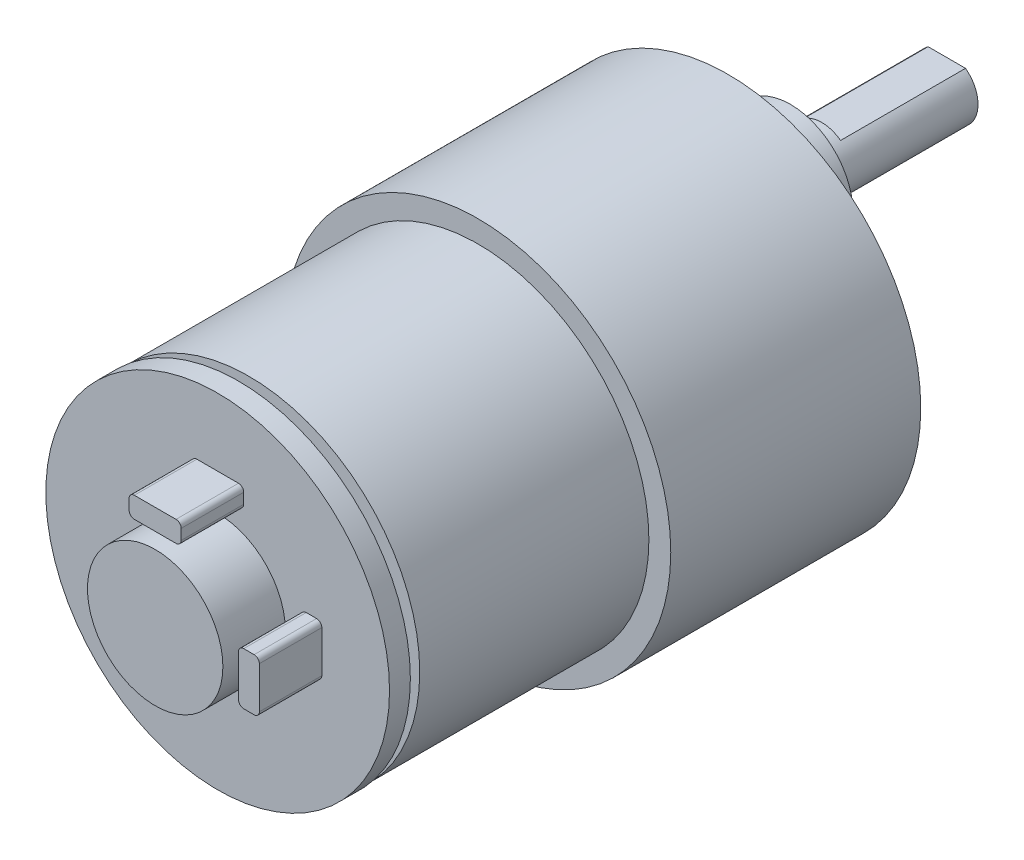
ISO-10303-21;
HEADER;
FILE_DESCRIPTION(('STEP AP214'),'2;1');
FILE_NAME('part.step','',(''),(''),'','','');
FILE_SCHEMA(('AUTOMOTIVE_DESIGN { 1 0 10303 214 1 1 1 1 }'));
ENDSEC;
DATA;
#1=APPLICATION_CONTEXT('core data for automotive mechanical design processes');
#2=APPLICATION_PROTOCOL_DEFINITION('international standard','automotive_design',2000,#1);
#3=PRODUCT_CONTEXT('',#1,'mechanical');
#4=PRODUCT('Part','Part','',(#3));
#5=PRODUCT_RELATED_PRODUCT_CATEGORY('part','',(#4));
#6=PRODUCT_DEFINITION_FORMATION('','',#4);
#7=PRODUCT_DEFINITION_CONTEXT('part definition',#1,'design');
#8=PRODUCT_DEFINITION('design','',#6,#7);
#9=PRODUCT_DEFINITION_SHAPE('','',#8);
#10=(LENGTH_UNIT() NAMED_UNIT(*) SI_UNIT(.MILLI.,.METRE.));
#11=(NAMED_UNIT(*) PLANE_ANGLE_UNIT() SI_UNIT($,.RADIAN.));
#12=(NAMED_UNIT(*) SI_UNIT($,.STERADIAN.) SOLID_ANGLE_UNIT());
#13=UNCERTAINTY_MEASURE_WITH_UNIT(LENGTH_MEASURE(1.E-05),#10,'distance_accuracy_value','');
#14=(GEOMETRIC_REPRESENTATION_CONTEXT(3) GLOBAL_UNCERTAINTY_ASSIGNED_CONTEXT((#13)) GLOBAL_UNIT_ASSIGNED_CONTEXT((#10,
#11,#12)) REPRESENTATION_CONTEXT('',''));
#15=CARTESIAN_POINT('',(0.,0.,0.));
#16=DIRECTION('',(0.,0.,1.));
#17=DIRECTION('',(1.,0.,0.));
#18=AXIS2_PLACEMENT_3D('',#15,#16,#17);
#19=CARTESIAN_POINT('',(0.,0.,49.));
#20=DIRECTION('',(0.,0.,1.));
#21=DIRECTION('',(1.,0.,0.));
#22=AXIS2_PLACEMENT_3D('',#19,#20,#21);
#23=PLANE('',#22);
#24=CARTESIAN_POINT('',(0.,0.,49.));
#25=DIRECTION('',(0.,0.,1.));
#26=DIRECTION('',(1.,0.,0.));
#27=AXIS2_PLACEMENT_3D('',#24,#25,#26);
#28=CIRCLE('',#27,6.5);
#29=CARTESIAN_POINT('',(6.5,0.,49.));
#30=VERTEX_POINT('',#29);
#31=EDGE_CURVE('E12',#30,#30,#28,.T.);
#32=ORIENTED_EDGE('',*,*,#31,.F.);
#33=EDGE_LOOP('',(#32));
#34=FACE_BOUND('',#33,.T.);
#35=CARTESIAN_POINT('',(0.,0.,49.));
#36=DIRECTION('',(0.,0.,1.));
#37=DIRECTION('',(1.,0.,0.));
#38=AXIS2_PLACEMENT_3D('',#35,#36,#37);
#39=CIRCLE('',#38,16.5);
#40=CARTESIAN_POINT('',(16.5,0.,49.));
#41=VERTEX_POINT('',#40);
#42=EDGE_CURVE('E290',#41,#41,#39,.T.);
#43=ORIENTED_EDGE('',*,*,#42,.T.);
#44=EDGE_LOOP('',(#43));
#45=FACE_BOUND('',#44,.T.);
#46=DIRECTION('',(0.,1.,0.));
#47=VECTOR('',#46,1.);
#48=CARTESIAN_POINT('',(10.,2.,49.));
#49=LINE('',#48,#47);
#50=CARTESIAN_POINT('',(10.,-2.,49.));
#51=VERTEX_POINT('',#50);
#52=CARTESIAN_POINT('',(10.,2.,49.));
#53=VERTEX_POINT('',#52);
#54=EDGE_CURVE('E205',#51,#53,#49,.T.);
#55=ORIENTED_EDGE('',*,*,#54,.F.);
#56=CARTESIAN_POINT('',(9.5,-2.,49.));
#57=DIRECTION('',(0.,0.,1.));
#58=DIRECTION('',(1.,0.,0.));
#59=AXIS2_PLACEMENT_3D('',#56,#57,#58);
#60=CIRCLE('',#59,0.5);
#61=CARTESIAN_POINT('',(9.5,-2.5,49.));
#62=VERTEX_POINT('',#61);
#63=EDGE_CURVE('E200',#62,#51,#60,.T.);
#64=ORIENTED_EDGE('',*,*,#63,.F.);
#65=DIRECTION('',(1.,0.,0.));
#66=VECTOR('',#65,1.);
#67=CARTESIAN_POINT('',(8.5,-2.5,49.));
#68=LINE('',#67,#66);
#69=CARTESIAN_POINT('',(8.5,-2.5,49.));
#70=VERTEX_POINT('',#69);
#71=EDGE_CURVE('E216',#70,#62,#68,.T.);
#72=ORIENTED_EDGE('',*,*,#71,.F.);
#73=CARTESIAN_POINT('',(8.5,-2.,49.));
#74=DIRECTION('',(0.,0.,1.));
#75=DIRECTION('',(1.,0.,0.));
#76=AXIS2_PLACEMENT_3D('',#73,#74,#75);
#77=CIRCLE('',#76,0.5);
#78=CARTESIAN_POINT('',(8.,-2.,49.));
#79=VERTEX_POINT('',#78);
#80=EDGE_CURVE('E252',#79,#70,#77,.T.);
#81=ORIENTED_EDGE('',*,*,#80,.F.);
#82=DIRECTION('',(0.,-1.,0.));
#83=VECTOR('',#82,1.);
#84=CARTESIAN_POINT('',(8.,2.,49.));
#85=LINE('',#84,#83);
#86=CARTESIAN_POINT('',(8.,2.,49.));
#87=VERTEX_POINT('',#86);
#88=EDGE_CURVE('E249',#87,#79,#85,.T.);
#89=ORIENTED_EDGE('',*,*,#88,.F.);
#90=CARTESIAN_POINT('',(8.5,2.,49.));
#91=DIRECTION('',(0.,0.,1.));
#92=DIRECTION('',(1.,0.,0.));
#93=AXIS2_PLACEMENT_3D('',#90,#91,#92);
#94=CIRCLE('',#93,0.5);
#95=CARTESIAN_POINT('',(8.5,2.5,49.));
#96=VERTEX_POINT('',#95);
#97=EDGE_CURVE('E246',#96,#87,#94,.T.);
#98=ORIENTED_EDGE('',*,*,#97,.F.);
#99=DIRECTION('',(-1.,0.,0.));
#100=VECTOR('',#99,1.);
#101=CARTESIAN_POINT('',(8.5,2.5,49.));
#102=LINE('',#101,#100);
#103=CARTESIAN_POINT('',(9.5,2.5,49.));
#104=VERTEX_POINT('',#103);
#105=EDGE_CURVE('E243',#104,#96,#102,.T.);
#106=ORIENTED_EDGE('',*,*,#105,.F.);
#107=CARTESIAN_POINT('',(9.5,2.,49.));
#108=DIRECTION('',(0.,0.,1.));
#109=DIRECTION('',(-1.,0.,0.));
#110=AXIS2_PLACEMENT_3D('',#107,#108,#109);
#111=CIRCLE('',#110,0.5);
#112=EDGE_CURVE('E240',#53,#104,#111,.T.);
#113=ORIENTED_EDGE('',*,*,#112,.F.);
#114=EDGE_LOOP('',(#55,#64,#72,#81,#89,#98,#106,#113));
#115=FACE_BOUND('',#114,.T.);
#116=DIRECTION('',(0.,1.,0.));
#117=VECTOR('',#116,1.);
#118=CARTESIAN_POINT('',(2.5,9.5,49.));
#119=LINE('',#118,#117);
#120=CARTESIAN_POINT('',(2.5,8.5,49.));
#121=VERTEX_POINT('',#120);
#122=CARTESIAN_POINT('',(2.5,9.5,49.));
#123=VERTEX_POINT('',#122);
#124=EDGE_CURVE('E892',#121,#123,#119,.T.);
#125=ORIENTED_EDGE('',*,*,#124,.F.);
#126=CARTESIAN_POINT('',(2.,8.5,49.));
#127=DIRECTION('',(0.,0.,1.));
#128=DIRECTION('',(1.,0.,0.));
#129=AXIS2_PLACEMENT_3D('',#126,#127,#128);
#130=CIRCLE('',#129,0.5);
#131=CARTESIAN_POINT('',(2.,8.,49.));
#132=VERTEX_POINT('',#131);
#133=EDGE_CURVE('E197',#132,#121,#130,.T.);
#134=ORIENTED_EDGE('',*,*,#133,.F.);
#135=DIRECTION('',(1.,0.,0.));
#136=VECTOR('',#135,1.);
#137=CARTESIAN_POINT('',(-2.,8.,49.));
#138=LINE('',#137,#136);
#139=CARTESIAN_POINT('',(-2.,8.,49.));
#140=VERTEX_POINT('',#139);
#141=EDGE_CURVE('E193',#140,#132,#138,.T.);
#142=ORIENTED_EDGE('',*,*,#141,.F.);
#143=CARTESIAN_POINT('',(-2.,8.5,49.));
#144=DIRECTION('',(0.,0.,1.));
#145=DIRECTION('',(1.,0.,0.));
#146=AXIS2_PLACEMENT_3D('',#143,#144,#145);
#147=CIRCLE('',#146,0.5);
#148=CARTESIAN_POINT('',(-2.5,8.5,49.));
#149=VERTEX_POINT('',#148);
#150=EDGE_CURVE('E887',#149,#140,#147,.T.);
#151=ORIENTED_EDGE('',*,*,#150,.F.);
#152=DIRECTION('',(0.,-1.,0.));
#153=VECTOR('',#152,1.);
#154=CARTESIAN_POINT('',(-2.5,9.5,49.));
#155=LINE('',#154,#153);
#156=CARTESIAN_POINT('',(-2.5,9.5,49.));
#157=VERTEX_POINT('',#156);
#158=EDGE_CURVE('E909',#157,#149,#155,.T.);
#159=ORIENTED_EDGE('',*,*,#158,.F.);
#160=CARTESIAN_POINT('',(-2.,9.5,49.));
#161=DIRECTION('',(0.,0.,1.));
#162=DIRECTION('',(1.,0.,0.));
#163=AXIS2_PLACEMENT_3D('',#160,#161,#162);
#164=CIRCLE('',#163,0.5);
#165=CARTESIAN_POINT('',(-2.,10.,49.));
#166=VERTEX_POINT('',#165);
#167=EDGE_CURVE('E906',#166,#157,#164,.T.);
#168=ORIENTED_EDGE('',*,*,#167,.F.);
#169=DIRECTION('',(-1.,0.,0.));
#170=VECTOR('',#169,1.);
#171=CARTESIAN_POINT('',(-2.,10.,49.));
#172=LINE('',#171,#170);
#173=CARTESIAN_POINT('',(2.,10.,49.));
#174=VERTEX_POINT('',#173);
#175=EDGE_CURVE('E903',#174,#166,#172,.T.);
#176=ORIENTED_EDGE('',*,*,#175,.F.);
#177=CARTESIAN_POINT('',(2.,9.5,49.));
#178=DIRECTION('',(0.,0.,1.));
#179=DIRECTION('',(-1.,0.,0.));
#180=AXIS2_PLACEMENT_3D('',#177,#178,#179);
#181=CIRCLE('',#180,0.5);
#182=EDGE_CURVE('E896',#123,#174,#181,.T.);
#183=ORIENTED_EDGE('',*,*,#182,.F.);
#184=EDGE_LOOP('',(#125,#134,#142,#151,#159,#168,#176,#183));
#185=FACE_BOUND('',#184,.T.);
#186=ADVANCED_FACE('F43',(#34,#45,#115,#185),#23,.T.);
#187=CARTESIAN_POINT('',(0.,0.,24.));
#188=DIRECTION('',(0.,0.,-1.));
#189=DIRECTION('',(-1.,0.,0.));
#190=AXIS2_PLACEMENT_3D('',#187,#188,#189);
#191=CYLINDRICAL_SURFACE('',#190,18.5);
#192=CARTESIAN_POINT('',(0.,0.,24.));
#193=DIRECTION('',(0.,0.,1.));
#194=DIRECTION('',(1.,0.,0.));
#195=AXIS2_PLACEMENT_3D('',#192,#193,#194);
#196=CIRCLE('',#195,18.5);
#197=CARTESIAN_POINT('',(18.5,0.,24.));
#198=VERTEX_POINT('',#197);
#199=EDGE_CURVE('E343',#198,#198,#196,.T.);
#200=ORIENTED_EDGE('',*,*,#199,.F.);
#201=EDGE_LOOP('',(#200));
#202=FACE_BOUND('',#201,.T.);
#203=CARTESIAN_POINT('',(0.,0.,0.));
#204=DIRECTION('',(0.,0.,1.));
#205=DIRECTION('',(1.,0.,0.));
#206=AXIS2_PLACEMENT_3D('',#203,#204,#205);
#207=CIRCLE('',#206,18.5);
#208=CARTESIAN_POINT('',(18.5,0.,0.));
#209=VERTEX_POINT('',#208);
#210=EDGE_CURVE('E353',#209,#209,#207,.T.);
#211=ORIENTED_EDGE('',*,*,#210,.T.);
#212=EDGE_LOOP('',(#211));
#213=FACE_BOUND('',#212,.T.);
#214=ADVANCED_FACE('F45',(#202,#213),#191,.T.);
#215=CARTESIAN_POINT('',(0.,0.,24.));
#216=DIRECTION('',(0.,0.,1.));
#217=DIRECTION('',(1.,0.,0.));
#218=AXIS2_PLACEMENT_3D('',#215,#216,#217);
#219=PLANE('',#218);
#220=CARTESIAN_POINT('',(0.,0.,24.));
#221=DIRECTION('',(0.,0.,1.));
#222=DIRECTION('',(1.,0.,0.));
#223=AXIS2_PLACEMENT_3D('',#220,#221,#222);
#224=CIRCLE('',#223,16.4);
#225=CARTESIAN_POINT('',(16.4,0.,24.));
#226=VERTEX_POINT('',#225);
#227=EDGE_CURVE('E339',#226,#226,#224,.T.);
#228=ORIENTED_EDGE('',*,*,#227,.F.);
#229=EDGE_LOOP('',(#228));
#230=FACE_BOUND('',#229,.T.);
#231=ORIENTED_EDGE('',*,*,#199,.T.);
#232=EDGE_LOOP('',(#231));
#233=FACE_BOUND('',#232,.T.);
#234=ADVANCED_FACE('F402',(#230,#233),#219,.T.);
#235=CARTESIAN_POINT('',(0.,0.,0.));
#236=DIRECTION('',(0.,0.,1.));
#237=DIRECTION('',(1.,0.,0.));
#238=AXIS2_PLACEMENT_3D('',#235,#236,#237);
#239=PLANE('',#238);
#240=CARTESIAN_POINT('',(0.,7.,0.));
#241=DIRECTION('',(0.,0.,1.));
#242=DIRECTION('',(1.,0.,0.));
#243=AXIS2_PLACEMENT_3D('',#240,#241,#242);
#244=CIRCLE('',#243,6.);
#245=CARTESIAN_POINT('',(6.,7.,0.));
#246=VERTEX_POINT('',#245);
#247=EDGE_CURVE('E47',#246,#246,#244,.F.);
#248=ORIENTED_EDGE('',*,*,#247,.F.);
#249=EDGE_LOOP('',(#248));
#250=FACE_BOUND('',#249,.T.);
#251=CARTESIAN_POINT('',(-15.5,0.,0.));
#252=DIRECTION('',(0.,0.,1.));
#253=DIRECTION('',(1.,0.,0.));
#254=AXIS2_PLACEMENT_3D('',#251,#252,#253);
#255=CIRCLE('',#254,1.5);
#256=CARTESIAN_POINT('',(-14.,0.,0.));
#257=VERTEX_POINT('',#256);
#258=EDGE_CURVE('E344',#257,#257,#255,.T.);
#259=ORIENTED_EDGE('',*,*,#258,.T.);
#260=EDGE_LOOP('',(#259));
#261=FACE_BOUND('',#260,.T.);
#262=CARTESIAN_POINT('',(7.74999999999987,-13.4233937586589,0.));
#263=DIRECTION('',(0.,0.,1.));
#264=DIRECTION('',(1.,0.,0.));
#265=AXIS2_PLACEMENT_3D('',#262,#263,#264);
#266=CIRCLE('',#265,1.5);
#267=CARTESIAN_POINT('',(9.24999999999988,-13.4233937586589,0.));
#268=VERTEX_POINT('',#267);
#269=EDGE_CURVE('E357',#268,#268,#266,.T.);
#270=ORIENTED_EDGE('',*,*,#269,.T.);
#271=EDGE_LOOP('',(#270));
#272=FACE_BOUND('',#271,.T.);
#273=CARTESIAN_POINT('',(15.5,-1.08235921504137E-13,0.));
#274=DIRECTION('',(0.,0.,1.));
#275=DIRECTION('',(1.,0.,0.));
#276=AXIS2_PLACEMENT_3D('',#273,#274,#275);
#277=CIRCLE('',#276,1.5);
#278=CARTESIAN_POINT('',(17.,-1.08235921504137E-13,0.));
#279=VERTEX_POINT('',#278);
#280=EDGE_CURVE('E382',#279,#279,#277,.T.);
#281=ORIENTED_EDGE('',*,*,#280,.T.);
#282=EDGE_LOOP('',(#281));
#283=FACE_BOUND('',#282,.T.);
#284=CARTESIAN_POINT('',(7.75000000000006,13.4233937586588,0.));
#285=DIRECTION('',(0.,0.,1.));
#286=DIRECTION('',(1.,0.,0.));
#287=AXIS2_PLACEMENT_3D('',#284,#285,#286);
#288=CIRCLE('',#287,1.5);
#289=CARTESIAN_POINT('',(9.25000000000006,13.4233937586588,0.));
#290=VERTEX_POINT('',#289);
#291=EDGE_CURVE('E374',#290,#290,#288,.T.);
#292=ORIENTED_EDGE('',*,*,#291,.T.);
#293=EDGE_LOOP('',(#292));
#294=FACE_BOUND('',#293,.T.);
#295=CARTESIAN_POINT('',(-7.75000000000016,-13.4233937586587,0.));
#296=DIRECTION('',(0.,0.,1.));
#297=DIRECTION('',(1.,0.,0.));
#298=AXIS2_PLACEMENT_3D('',#295,#296,#297);
#299=CIRCLE('',#298,1.5);
#300=CARTESIAN_POINT('',(-6.25000000000015,-13.4233937586587,0.));
#301=VERTEX_POINT('',#300);
#302=EDGE_CURVE('E366',#301,#301,#299,.T.);
#303=ORIENTED_EDGE('',*,*,#302,.T.);
#304=EDGE_LOOP('',(#303));
#305=FACE_BOUND('',#304,.T.);
#306=CARTESIAN_POINT('',(-7.74999999999997,13.4233937586588,0.));
#307=DIRECTION('',(0.,0.,1.));
#308=DIRECTION('',(1.,0.,0.));
#309=AXIS2_PLACEMENT_3D('',#306,#307,#308);
#310=CIRCLE('',#309,1.5);
#311=CARTESIAN_POINT('',(-6.24999999999997,13.4233937586588,0.));
#312=VERTEX_POINT('',#311);
#313=EDGE_CURVE('E349',#312,#312,#310,.T.);
#314=ORIENTED_EDGE('',*,*,#313,.T.);
#315=EDGE_LOOP('',(#314));
#316=FACE_BOUND('',#315,.T.);
#317=ORIENTED_EDGE('',*,*,#210,.F.);
#318=EDGE_LOOP('',(#317));
#319=FACE_BOUND('',#318,.T.);
#320=ADVANCED_FACE('F399',(#250,#261,#272,#283,#294,#305,#316,#319),#239,.F.);
#321=CARTESIAN_POINT('',(-7.74999999999997,13.4233937586588,28.2426406871193));
#322=DIRECTION('',(0.,0.,-1.));
#323=DIRECTION('',(-1.,0.,0.));
#324=AXIS2_PLACEMENT_3D('',#321,#322,#323);
#325=CYLINDRICAL_SURFACE('',#324,1.5);
#326=ORIENTED_EDGE('',*,*,#313,.F.);
#327=EDGE_LOOP('',(#326));
#328=FACE_BOUND('',#327,.T.);
#329=CARTESIAN_POINT('',(-7.74999999999997,13.4233937586588,20.));
#330=DIRECTION('',(0.,0.,1.));
#331=DIRECTION('',(1.,0.,0.));
#332=AXIS2_PLACEMENT_3D('',#329,#330,#331);
#333=CIRCLE('',#332,1.5);
#334=CARTESIAN_POINT('',(-6.24999999999997,13.4233937586588,20.));
#335=VERTEX_POINT('',#334);
#336=EDGE_CURVE('E362',#335,#335,#333,.T.);
#337=ORIENTED_EDGE('',*,*,#336,.T.);
#338=EDGE_LOOP('',(#337));
#339=FACE_BOUND('',#338,.T.);
#340=ADVANCED_FACE('F401',(#328,#339),#325,.F.);
#341=CARTESIAN_POINT('',(0.,0.,20.));
#342=DIRECTION('',(0.,0.,1.));
#343=DIRECTION('',(1.,0.,0.));
#344=AXIS2_PLACEMENT_3D('',#341,#342,#343);
#345=PLANE('',#344);
#346=ORIENTED_EDGE('',*,*,#336,.F.);
#347=EDGE_LOOP('',(#346));
#348=FACE_BOUND('',#347,.T.);
#349=ADVANCED_FACE('F408',(#348),#345,.F.);
#350=CARTESIAN_POINT('',(-7.75000000000016,-13.4233937586587,28.2426406871193));
#351=DIRECTION('',(0.,0.,-1.));
#352=DIRECTION('',(-1.,0.,0.));
#353=AXIS2_PLACEMENT_3D('',#350,#351,#352);
#354=CYLINDRICAL_SURFACE('',#353,1.5);
#355=ORIENTED_EDGE('',*,*,#302,.F.);
#356=EDGE_LOOP('',(#355));
#357=FACE_BOUND('',#356,.T.);
#358=CARTESIAN_POINT('',(-7.75000000000016,-13.4233937586587,20.));
#359=DIRECTION('',(0.,0.,1.));
#360=DIRECTION('',(1.,0.,0.));
#361=AXIS2_PLACEMENT_3D('',#358,#359,#360);
#362=CIRCLE('',#361,1.5);
#363=CARTESIAN_POINT('',(-6.25000000000015,-13.4233937586587,20.));
#364=VERTEX_POINT('',#363);
#365=EDGE_CURVE('E370',#364,#364,#362,.T.);
#366=ORIENTED_EDGE('',*,*,#365,.T.);
#367=EDGE_LOOP('',(#366));
#368=FACE_BOUND('',#367,.T.);
#369=ADVANCED_FACE('F490',(#357,#368),#354,.F.);
#370=CARTESIAN_POINT('',(0.,0.,20.));
#371=DIRECTION('',(0.,0.,1.));
#372=DIRECTION('',(1.,0.,0.));
#373=AXIS2_PLACEMENT_3D('',#370,#371,#372);
#374=PLANE('',#373);
#375=ORIENTED_EDGE('',*,*,#365,.F.);
#376=EDGE_LOOP('',(#375));
#377=FACE_BOUND('',#376,.T.);
#378=ADVANCED_FACE('F493',(#377),#374,.F.);
#379=CARTESIAN_POINT('',(7.75000000000006,13.4233937586588,28.2426406871193));
#380=DIRECTION('',(0.,0.,-1.));
#381=DIRECTION('',(-1.,0.,0.));
#382=AXIS2_PLACEMENT_3D('',#379,#380,#381);
#383=CYLINDRICAL_SURFACE('',#382,1.5);
#384=ORIENTED_EDGE('',*,*,#291,.F.);
#385=EDGE_LOOP('',(#384));
#386=FACE_BOUND('',#385,.T.);
#387=CARTESIAN_POINT('',(7.75000000000006,13.4233937586588,20.));
#388=DIRECTION('',(0.,0.,1.));
#389=DIRECTION('',(1.,0.,0.));
#390=AXIS2_PLACEMENT_3D('',#387,#388,#389);
#391=CIRCLE('',#390,1.5);
#392=CARTESIAN_POINT('',(9.25000000000006,13.4233937586588,20.));
#393=VERTEX_POINT('',#392);
#394=EDGE_CURVE('E378',#393,#393,#391,.T.);
#395=ORIENTED_EDGE('',*,*,#394,.T.);
#396=EDGE_LOOP('',(#395));
#397=FACE_BOUND('',#396,.T.);
#398=ADVANCED_FACE('F496',(#386,#397),#383,.F.);
#399=CARTESIAN_POINT('',(0.,0.,20.));
#400=DIRECTION('',(0.,0.,1.));
#401=DIRECTION('',(1.,0.,0.));
#402=AXIS2_PLACEMENT_3D('',#399,#400,#401);
#403=PLANE('',#402);
#404=ORIENTED_EDGE('',*,*,#394,.F.);
#405=EDGE_LOOP('',(#404));
#406=FACE_BOUND('',#405,.T.);
#407=ADVANCED_FACE('F501',(#406),#403,.F.);
#408=CARTESIAN_POINT('',(15.5,-1.08235921504137E-13,28.2426406871193));
#409=DIRECTION('',(0.,0.,-1.));
#410=DIRECTION('',(-1.,0.,0.));
#411=AXIS2_PLACEMENT_3D('',#408,#409,#410);
#412=CYLINDRICAL_SURFACE('',#411,1.5);
#413=ORIENTED_EDGE('',*,*,#280,.F.);
#414=EDGE_LOOP('',(#413));
#415=FACE_BOUND('',#414,.T.);
#416=CARTESIAN_POINT('',(15.5,-1.08235921504137E-13,20.));
#417=DIRECTION('',(0.,0.,1.));
#418=DIRECTION('',(1.,0.,0.));
#419=AXIS2_PLACEMENT_3D('',#416,#417,#418);
#420=CIRCLE('',#419,1.5);
#421=CARTESIAN_POINT('',(17.,-1.08235921504137E-13,20.));
#422=VERTEX_POINT('',#421);
#423=EDGE_CURVE('E361',#422,#422,#420,.T.);
#424=ORIENTED_EDGE('',*,*,#423,.T.);
#425=EDGE_LOOP('',(#424));
#426=FACE_BOUND('',#425,.T.);
#427=ADVANCED_FACE('F504',(#415,#426),#412,.F.);
#428=CARTESIAN_POINT('',(0.,0.,20.));
#429=DIRECTION('',(0.,0.,1.));
#430=DIRECTION('',(1.,0.,0.));
#431=AXIS2_PLACEMENT_3D('',#428,#429,#430);
#432=PLANE('',#431);
#433=ORIENTED_EDGE('',*,*,#423,.F.);
#434=EDGE_LOOP('',(#433));
#435=FACE_BOUND('',#434,.T.);
#436=ADVANCED_FACE('F487',(#435),#432,.F.);
#437=CARTESIAN_POINT('',(7.74999999999987,-13.4233937586589,28.2426406871193));
#438=DIRECTION('',(0.,0.,-1.));
#439=DIRECTION('',(-1.,0.,0.));
#440=AXIS2_PLACEMENT_3D('',#437,#438,#439);
#441=CYLINDRICAL_SURFACE('',#440,1.5);
#442=ORIENTED_EDGE('',*,*,#269,.F.);
#443=EDGE_LOOP('',(#442));
#444=FACE_BOUND('',#443,.T.);
#445=CARTESIAN_POINT('',(7.74999999999987,-13.4233937586589,20.));
#446=DIRECTION('',(0.,0.,1.));
#447=DIRECTION('',(1.,0.,0.));
#448=AXIS2_PLACEMENT_3D('',#445,#446,#447);
#449=CIRCLE('',#448,1.5);
#450=CARTESIAN_POINT('',(9.24999999999988,-13.4233937586589,20.));
#451=VERTEX_POINT('',#450);
#452=EDGE_CURVE('E338',#451,#451,#449,.T.);
#453=ORIENTED_EDGE('',*,*,#452,.T.);
#454=EDGE_LOOP('',(#453));
#455=FACE_BOUND('',#454,.T.);
#456=ADVANCED_FACE('F483',(#444,#455),#441,.F.);
#457=CARTESIAN_POINT('',(0.,0.,20.));
#458=DIRECTION('',(0.,0.,1.));
#459=DIRECTION('',(1.,0.,0.));
#460=AXIS2_PLACEMENT_3D('',#457,#458,#459);
#461=PLANE('',#460);
#462=ORIENTED_EDGE('',*,*,#452,.F.);
#463=EDGE_LOOP('',(#462));
#464=FACE_BOUND('',#463,.T.);
#465=ADVANCED_FACE('F476',(#464),#461,.F.);
#466=CARTESIAN_POINT('',(-15.5,0.,28.2426406871193));
#467=DIRECTION('',(0.,0.,-1.));
#468=DIRECTION('',(-1.,0.,0.));
#469=AXIS2_PLACEMENT_3D('',#466,#467,#468);
#470=CYLINDRICAL_SURFACE('',#469,1.5);
#471=ORIENTED_EDGE('',*,*,#258,.F.);
#472=EDGE_LOOP('',(#471));
#473=FACE_BOUND('',#472,.T.);
#474=CARTESIAN_POINT('',(-15.5,0.,20.));
#475=DIRECTION('',(0.,0.,1.));
#476=DIRECTION('',(1.,0.,0.));
#477=AXIS2_PLACEMENT_3D('',#474,#475,#476);
#478=CIRCLE('',#477,1.5);
#479=CARTESIAN_POINT('',(-14.,0.,20.));
#480=VERTEX_POINT('',#479);
#481=EDGE_CURVE('E348',#480,#480,#478,.T.);
#482=ORIENTED_EDGE('',*,*,#481,.T.);
#483=EDGE_LOOP('',(#482));
#484=FACE_BOUND('',#483,.T.);
#485=ADVANCED_FACE('F473',(#473,#484),#470,.F.);
#486=CARTESIAN_POINT('',(0.,0.,20.));
#487=DIRECTION('',(0.,0.,1.));
#488=DIRECTION('',(1.,0.,0.));
#489=AXIS2_PLACEMENT_3D('',#486,#487,#488);
#490=PLANE('',#489);
#491=ORIENTED_EDGE('',*,*,#481,.F.);
#492=EDGE_LOOP('',(#491));
#493=FACE_BOUND('',#492,.T.);
#494=ADVANCED_FACE('F471',(#493),#490,.F.);
#495=CARTESIAN_POINT('',(0.,0.,46.));
#496=DIRECTION('',(0.,0.,-1.));
#497=DIRECTION('',(-1.,0.,0.));
#498=AXIS2_PLACEMENT_3D('',#495,#496,#497);
#499=CYLINDRICAL_SURFACE('',#498,16.4);
#500=CARTESIAN_POINT('',(0.,0.,46.));
#501=DIRECTION('',(0.,0.,1.));
#502=DIRECTION('',(1.,0.,0.));
#503=AXIS2_PLACEMENT_3D('',#500,#501,#502);
#504=CIRCLE('',#503,16.4);
#505=CARTESIAN_POINT('',(16.4,0.,46.));
#506=VERTEX_POINT('',#505);
#507=EDGE_CURVE('E334',#506,#506,#504,.T.);
#508=ORIENTED_EDGE('',*,*,#507,.F.);
#509=EDGE_LOOP('',(#508));
#510=FACE_BOUND('',#509,.T.);
#511=ORIENTED_EDGE('',*,*,#227,.T.);
#512=EDGE_LOOP('',(#511));
#513=FACE_BOUND('',#512,.T.);
#514=ADVANCED_FACE('F467',(#510,#513),#499,.T.);
#515=CARTESIAN_POINT('',(0.,0.,46.));
#516=DIRECTION('',(0.,0.,1.));
#517=DIRECTION('',(1.,0.,0.));
#518=AXIS2_PLACEMENT_3D('',#515,#516,#517);
#519=PLANE('',#518);
#520=CARTESIAN_POINT('',(0.,0.,46.));
#521=DIRECTION('',(0.,0.,1.));
#522=DIRECTION('',(1.,0.,0.));
#523=AXIS2_PLACEMENT_3D('',#520,#521,#522);
#524=CIRCLE('',#523,15.);
#525=CARTESIAN_POINT('',(15.,0.,46.));
#526=VERTEX_POINT('',#525);
#527=EDGE_CURVE('E53',#526,#526,#524,.T.);
#528=ORIENTED_EDGE('',*,*,#527,.F.);
#529=EDGE_LOOP('',(#528));
#530=FACE_BOUND('',#529,.T.);
#531=ORIENTED_EDGE('',*,*,#507,.T.);
#532=EDGE_LOOP('',(#531));
#533=FACE_BOUND('',#532,.T.);
#534=ADVANCED_FACE('F463',(#530,#533),#519,.T.);
#535=CARTESIAN_POINT('',(0.,7.,-6.));
#536=DIRECTION('',(0.,0.,1.));
#537=DIRECTION('',(1.,0.,0.));
#538=AXIS2_PLACEMENT_3D('',#535,#536,#537);
#539=CYLINDRICAL_SURFACE('',#538,6.);
#540=CARTESIAN_POINT('',(0.,7.,-6.));
#541=DIRECTION('',(0.,0.,-1.));
#542=DIRECTION('',(-1.,0.,0.));
#543=AXIS2_PLACEMENT_3D('',#540,#541,#542);
#544=CIRCLE('',#543,6.);
#545=CARTESIAN_POINT('',(-6.,7.,-6.));
#546=VERTEX_POINT('',#545);
#547=EDGE_CURVE('E327',#546,#546,#544,.T.);
#548=ORIENTED_EDGE('',*,*,#547,.F.);
#549=EDGE_LOOP('',(#548));
#550=FACE_BOUND('',#549,.T.);
#551=ORIENTED_EDGE('',*,*,#247,.T.);
#552=EDGE_LOOP('',(#551));
#553=FACE_BOUND('',#552,.T.);
#554=ADVANCED_FACE('F459',(#550,#553),#539,.T.);
#555=CARTESIAN_POINT('',(0.,7.,-6.));
#556=DIRECTION('',(0.,0.,-1.));
#557=DIRECTION('',(-1.,0.,0.));
#558=AXIS2_PLACEMENT_3D('',#555,#556,#557);
#559=PLANE('',#558);
#560=CARTESIAN_POINT('',(0.,7.,-6.));
#561=DIRECTION('',(0.,0.,-1.));
#562=DIRECTION('',(-1.,0.,0.));
#563=AXIS2_PLACEMENT_3D('',#560,#561,#562);
#564=CIRCLE('',#563,3.);
#565=CARTESIAN_POINT('',(-3.,7.,-6.));
#566=VERTEX_POINT('',#565);
#567=EDGE_CURVE('E305',#566,#566,#564,.T.);
#568=ORIENTED_EDGE('',*,*,#567,.F.);
#569=EDGE_LOOP('',(#568));
#570=FACE_BOUND('',#569,.T.);
#571=ORIENTED_EDGE('',*,*,#547,.T.);
#572=EDGE_LOOP('',(#571));
#573=FACE_BOUND('',#572,.T.);
#574=ADVANCED_FACE('F455',(#570,#573),#559,.T.);
#575=CARTESIAN_POINT('',(0.,7.,-9.));
#576=DIRECTION('',(0.,0.,1.));
#577=DIRECTION('',(1.,0.,0.));
#578=AXIS2_PLACEMENT_3D('',#575,#576,#577);
#579=CYLINDRICAL_SURFACE('',#578,3.);
#580=CARTESIAN_POINT('',(0.,7.,-9.));
#581=DIRECTION('',(0.,0.,-1.));
#582=DIRECTION('',(-1.,0.,0.));
#583=AXIS2_PLACEMENT_3D('',#580,#581,#582);
#584=CIRCLE('',#583,3.);
#585=CARTESIAN_POINT('',(-1.8,9.4,-9.));
#586=VERTEX_POINT('',#585);
#587=CARTESIAN_POINT('',(1.8,9.4,-9.));
#588=VERTEX_POINT('',#587);
#589=EDGE_CURVE('E324',#586,#588,#584,.T.);
#590=ORIENTED_EDGE('',*,*,#589,.F.);
#591=DIRECTION('',(0.,0.,1.));
#592=VECTOR('',#591,1.);
#593=CARTESIAN_POINT('',(-1.8,9.4,-21.));
#594=LINE('',#593,#592);
#595=CARTESIAN_POINT('',(-1.8,9.4,-21.));
#596=VERTEX_POINT('',#595);
#597=EDGE_CURVE('E320',#596,#586,#594,.T.);
#598=ORIENTED_EDGE('',*,*,#597,.F.);
#599=CARTESIAN_POINT('',(0.,7.,-21.));
#600=DIRECTION('',(0.,0.,-1.));
#601=DIRECTION('',(-1.,0.,0.));
#602=AXIS2_PLACEMENT_3D('',#599,#600,#601);
#603=CIRCLE('',#602,3.);
#604=CARTESIAN_POINT('',(1.8,9.4,-21.));
#605=VERTEX_POINT('',#604);
#606=EDGE_CURVE('E306',#605,#596,#603,.T.);
#607=ORIENTED_EDGE('',*,*,#606,.F.);
#608=DIRECTION('',(0.,0.,1.));
#609=VECTOR('',#608,1.);
#610=CARTESIAN_POINT('',(1.8,9.4,-21.));
#611=LINE('',#610,#609);
#612=EDGE_CURVE('E313',#605,#588,#611,.T.);
#613=ORIENTED_EDGE('',*,*,#612,.T.);
#614=EDGE_LOOP('',(#590,#598,#607,#613));
#615=FACE_BOUND('',#614,.T.);
#616=ORIENTED_EDGE('',*,*,#567,.T.);
#617=EDGE_LOOP('',(#616));
#618=FACE_BOUND('',#617,.T.);
#619=ADVANCED_FACE('F451',(#615,#618),#579,.T.);
#620=CARTESIAN_POINT('',(0.,7.,-9.));
#621=DIRECTION('',(0.,0.,-1.));
#622=DIRECTION('',(-1.,0.,0.));
#623=AXIS2_PLACEMENT_3D('',#620,#621,#622);
#624=PLANE('',#623);
#625=DIRECTION('',(1.,0.,0.));
#626=VECTOR('',#625,1.);
#627=CARTESIAN_POINT('',(1.8,9.4,-9.));
#628=LINE('',#627,#626);
#629=EDGE_CURVE('E301',#586,#588,#628,.T.);
#630=ORIENTED_EDGE('',*,*,#629,.F.);
#631=ORIENTED_EDGE('',*,*,#589,.T.);
#632=EDGE_LOOP('',(#630,#631));
#633=FACE_BOUND('',#632,.T.);
#634=ADVANCED_FACE('F447',(#633),#624,.T.);
#635=CARTESIAN_POINT('',(1.8,9.4,-21.));
#636=DIRECTION('',(0.,-1.,0.));
#637=DIRECTION('',(0.,0.,-1.));
#638=AXIS2_PLACEMENT_3D('',#635,#636,#637);
#639=PLANE('',#638);
#640=ORIENTED_EDGE('',*,*,#629,.T.);
#641=ORIENTED_EDGE('',*,*,#612,.F.);
#642=DIRECTION('',(1.,0.,0.));
#643=VECTOR('',#642,1.);
#644=CARTESIAN_POINT('',(1.8,9.4,-21.));
#645=LINE('',#644,#643);
#646=EDGE_CURVE('E310',#596,#605,#645,.T.);
#647=ORIENTED_EDGE('',*,*,#646,.F.);
#648=ORIENTED_EDGE('',*,*,#597,.T.);
#649=EDGE_LOOP('',(#640,#641,#647,#648));
#650=FACE_BOUND('',#649,.T.);
#651=ADVANCED_FACE('F443',(#650),#639,.F.);
#652=CARTESIAN_POINT('',(0.,7.,-21.));
#653=DIRECTION('',(0.,0.,-1.));
#654=DIRECTION('',(-1.,0.,0.));
#655=AXIS2_PLACEMENT_3D('',#652,#653,#654);
#656=PLANE('',#655);
#657=ORIENTED_EDGE('',*,*,#606,.T.);
#658=ORIENTED_EDGE('',*,*,#646,.T.);
#659=EDGE_LOOP('',(#657,#658));
#660=FACE_BOUND('',#659,.T.);
#661=ADVANCED_FACE('F439',(#660),#656,.T.);
#662=CARTESIAN_POINT('',(0.,0.,47.));
#663=DIRECTION('',(0.,0.,-1.));
#664=DIRECTION('',(-1.,0.,0.));
#665=AXIS2_PLACEMENT_3D('',#662,#663,#664);
#666=CYLINDRICAL_SURFACE('',#665,15.);
#667=CARTESIAN_POINT('',(0.,0.,47.));
#668=DIRECTION('',(0.,0.,1.));
#669=DIRECTION('',(1.,0.,0.));
#670=AXIS2_PLACEMENT_3D('',#667,#668,#669);
#671=CIRCLE('',#670,15.);
#672=CARTESIAN_POINT('',(15.,0.,47.));
#673=VERTEX_POINT('',#672);
#674=EDGE_CURVE('E294',#673,#673,#671,.T.);
#675=ORIENTED_EDGE('',*,*,#674,.F.);
#676=EDGE_LOOP('',(#675));
#677=FACE_BOUND('',#676,.T.);
#678=ORIENTED_EDGE('',*,*,#527,.T.);
#679=EDGE_LOOP('',(#678));
#680=FACE_BOUND('',#679,.T.);
#681=ADVANCED_FACE('F435',(#677,#680),#666,.T.);
#682=CARTESIAN_POINT('',(0.,0.,49.));
#683=DIRECTION('',(0.,0.,-1.));
#684=DIRECTION('',(-1.,0.,0.));
#685=AXIS2_PLACEMENT_3D('',#682,#683,#684);
#686=CYLINDRICAL_SURFACE('',#685,16.5);
#687=ORIENTED_EDGE('',*,*,#42,.F.);
#688=EDGE_LOOP('',(#687));
#689=FACE_BOUND('',#688,.T.);
#690=CARTESIAN_POINT('',(0.,0.,47.));
#691=DIRECTION('',(0.,0.,1.));
#692=DIRECTION('',(1.,0.,0.));
#693=AXIS2_PLACEMENT_3D('',#690,#691,#692);
#694=CIRCLE('',#693,16.5);
#695=CARTESIAN_POINT('',(16.5,0.,47.));
#696=VERTEX_POINT('',#695);
#697=EDGE_CURVE('E288',#696,#696,#694,.T.);
#698=ORIENTED_EDGE('',*,*,#697,.T.);
#699=EDGE_LOOP('',(#698));
#700=FACE_BOUND('',#699,.T.);
#701=ADVANCED_FACE('F431',(#689,#700),#686,.T.);
#702=CARTESIAN_POINT('',(0.,0.,47.));
#703=DIRECTION('',(0.,0.,1.));
#704=DIRECTION('',(1.,0.,0.));
#705=AXIS2_PLACEMENT_3D('',#702,#703,#704);
#706=PLANE('',#705);
#707=ORIENTED_EDGE('',*,*,#674,.T.);
#708=EDGE_LOOP('',(#707));
#709=FACE_BOUND('',#708,.T.);
#710=ORIENTED_EDGE('',*,*,#697,.F.);
#711=EDGE_LOOP('',(#710));
#712=FACE_BOUND('',#711,.T.);
#713=ADVANCED_FACE('F428',(#709,#712),#706,.F.);
#714=CARTESIAN_POINT('',(0.,0.,55.));
#715=DIRECTION('',(0.,0.,-1.));
#716=DIRECTION('',(-1.,0.,0.));
#717=AXIS2_PLACEMENT_3D('',#714,#715,#716);
#718=CYLINDRICAL_SURFACE('',#717,6.5);
#719=CARTESIAN_POINT('',(0.,0.,55.));
#720=DIRECTION('',(0.,0.,1.));
#721=DIRECTION('',(1.,0.,0.));
#722=AXIS2_PLACEMENT_3D('',#719,#720,#721);
#723=CIRCLE('',#722,6.5);
#724=CARTESIAN_POINT('',(6.5,0.,55.));
#725=VERTEX_POINT('',#724);
#726=EDGE_CURVE('E285',#725,#725,#723,.T.);
#727=ORIENTED_EDGE('',*,*,#726,.F.);
#728=EDGE_LOOP('',(#727));
#729=FACE_BOUND('',#728,.T.);
#730=ORIENTED_EDGE('',*,*,#31,.T.);
#731=EDGE_LOOP('',(#730));
#732=FACE_BOUND('',#731,.T.);
#733=ADVANCED_FACE('F426',(#729,#732),#718,.T.);
#734=CARTESIAN_POINT('',(0.,0.,55.));
#735=DIRECTION('',(0.,0.,1.));
#736=DIRECTION('',(1.,0.,0.));
#737=AXIS2_PLACEMENT_3D('',#734,#735,#736);
#738=PLANE('',#737);
#739=ORIENTED_EDGE('',*,*,#726,.T.);
#740=EDGE_LOOP('',(#739));
#741=FACE_BOUND('',#740,.T.);
#742=ADVANCED_FACE('F605',(#741),#738,.T.);
#743=CARTESIAN_POINT('',(9.5,-2.,55.));
#744=DIRECTION('',(0.,0.,-1.));
#745=DIRECTION('',(-1.,0.,0.));
#746=AXIS2_PLACEMENT_3D('',#743,#744,#745);
#747=CYLINDRICAL_SURFACE('',#746,0.5);
#748=ORIENTED_EDGE('',*,*,#63,.T.);
#749=DIRECTION('',(0.,0.,-1.));
#750=VECTOR('',#749,1.);
#751=CARTESIAN_POINT('',(10.,-2.,55.));
#752=LINE('',#751,#750);
#753=CARTESIAN_POINT('',(10.,-2.,55.));
#754=VERTEX_POINT('',#753);
#755=EDGE_CURVE('E282',#754,#51,#752,.T.);
#756=ORIENTED_EDGE('',*,*,#755,.F.);
#757=CARTESIAN_POINT('',(9.5,-2.,55.));
#758=DIRECTION('',(0.,0.,1.));
#759=DIRECTION('',(1.,0.,0.));
#760=AXIS2_PLACEMENT_3D('',#757,#758,#759);
#761=CIRCLE('',#760,0.5);
#762=CARTESIAN_POINT('',(9.5,-2.5,55.));
#763=VERTEX_POINT('',#762);
#764=EDGE_CURVE('E211',#763,#754,#761,.T.);
#765=ORIENTED_EDGE('',*,*,#764,.F.);
#766=DIRECTION('',(0.,0.,-1.));
#767=VECTOR('',#766,1.);
#768=CARTESIAN_POINT('',(9.5,-2.5,55.));
#769=LINE('',#768,#767);
#770=EDGE_CURVE('E236',#763,#62,#769,.T.);
#771=ORIENTED_EDGE('',*,*,#770,.T.);
#772=EDGE_LOOP('',(#748,#756,#765,#771));
#773=FACE_BOUND('',#772,.T.);
#774=ADVANCED_FACE('F612',(#773),#747,.T.);
#775=CARTESIAN_POINT('',(10.,2.,55.));
#776=DIRECTION('',(-1.,0.,0.));
#777=DIRECTION('',(0.,0.,1.));
#778=AXIS2_PLACEMENT_3D('',#775,#776,#777);
#779=PLANE('',#778);
#780=ORIENTED_EDGE('',*,*,#54,.T.);
#781=DIRECTION('',(0.,0.,-1.));
#782=VECTOR('',#781,1.);
#783=CARTESIAN_POINT('',(10.,2.,55.));
#784=LINE('',#783,#782);
#785=CARTESIAN_POINT('',(10.,2.,55.));
#786=VERTEX_POINT('',#785);
#787=EDGE_CURVE('E278',#786,#53,#784,.T.);
#788=ORIENTED_EDGE('',*,*,#787,.F.);
#789=DIRECTION('',(0.,1.,0.));
#790=VECTOR('',#789,1.);
#791=CARTESIAN_POINT('',(10.,2.,55.));
#792=LINE('',#791,#790);
#793=EDGE_CURVE('E215',#754,#786,#792,.T.);
#794=ORIENTED_EDGE('',*,*,#793,.F.);
#795=ORIENTED_EDGE('',*,*,#755,.T.);
#796=EDGE_LOOP('',(#780,#788,#794,#795));
#797=FACE_BOUND('',#796,.T.);
#798=ADVANCED_FACE('F619',(#797),#779,.F.);
#799=CARTESIAN_POINT('',(9.5,2.,55.));
#800=DIRECTION('',(0.,0.,-1.));
#801=DIRECTION('',(-1.,0.,0.));
#802=AXIS2_PLACEMENT_3D('',#799,#800,#801);
#803=CYLINDRICAL_SURFACE('',#802,0.5);
#804=ORIENTED_EDGE('',*,*,#112,.T.);
#805=DIRECTION('',(0.,0.,-1.));
#806=VECTOR('',#805,1.);
#807=CARTESIAN_POINT('',(9.5,2.5,55.));
#808=LINE('',#807,#806);
#809=CARTESIAN_POINT('',(9.5,2.5,55.));
#810=VERTEX_POINT('',#809);
#811=EDGE_CURVE('E274',#810,#104,#808,.T.);
#812=ORIENTED_EDGE('',*,*,#811,.F.);
#813=CARTESIAN_POINT('',(9.5,2.,55.));
#814=DIRECTION('',(0.,0.,1.));
#815=DIRECTION('',(-1.,0.,0.));
#816=AXIS2_PLACEMENT_3D('',#813,#814,#815);
#817=CIRCLE('',#816,0.5);
#818=EDGE_CURVE('E219',#786,#810,#817,.T.);
#819=ORIENTED_EDGE('',*,*,#818,.F.);
#820=ORIENTED_EDGE('',*,*,#787,.T.);
#821=EDGE_LOOP('',(#804,#812,#819,#820));
#822=FACE_BOUND('',#821,.T.);
#823=ADVANCED_FACE('F627',(#822),#803,.T.);
#824=CARTESIAN_POINT('',(8.5,2.5,55.));
#825=DIRECTION('',(0.,-1.,0.));
#826=DIRECTION('',(1.,0.,0.));
#827=AXIS2_PLACEMENT_3D('',#824,#825,#826);
#828=PLANE('',#827);
#829=ORIENTED_EDGE('',*,*,#105,.T.);
#830=DIRECTION('',(0.,0.,-1.));
#831=VECTOR('',#830,1.);
#832=CARTESIAN_POINT('',(8.5,2.5,55.));
#833=LINE('',#832,#831);
#834=CARTESIAN_POINT('',(8.5,2.5,55.));
#835=VERTEX_POINT('',#834);
#836=EDGE_CURVE('E270',#835,#96,#833,.T.);
#837=ORIENTED_EDGE('',*,*,#836,.F.);
#838=DIRECTION('',(-1.,0.,0.));
#839=VECTOR('',#838,1.);
#840=CARTESIAN_POINT('',(8.5,2.5,55.));
#841=LINE('',#840,#839);
#842=EDGE_CURVE('E222',#810,#835,#841,.T.);
#843=ORIENTED_EDGE('',*,*,#842,.F.);
#844=ORIENTED_EDGE('',*,*,#811,.T.);
#845=EDGE_LOOP('',(#829,#837,#843,#844));
#846=FACE_BOUND('',#845,.T.);
#847=ADVANCED_FACE('F635',(#846),#828,.F.);
#848=CARTESIAN_POINT('',(8.5,2.,55.));
#849=DIRECTION('',(0.,0.,-1.));
#850=DIRECTION('',(-1.,0.,0.));
#851=AXIS2_PLACEMENT_3D('',#848,#849,#850);
#852=CYLINDRICAL_SURFACE('',#851,0.5);
#853=ORIENTED_EDGE('',*,*,#97,.T.);
#854=DIRECTION('',(0.,0.,-1.));
#855=VECTOR('',#854,1.);
#856=CARTESIAN_POINT('',(8.,2.,55.));
#857=LINE('',#856,#855);
#858=CARTESIAN_POINT('',(8.,2.,55.));
#859=VERTEX_POINT('',#858);
#860=EDGE_CURVE('E266',#859,#87,#857,.T.);
#861=ORIENTED_EDGE('',*,*,#860,.F.);
#862=CARTESIAN_POINT('',(8.5,2.,55.));
#863=DIRECTION('',(0.,0.,1.));
#864=DIRECTION('',(1.,0.,0.));
#865=AXIS2_PLACEMENT_3D('',#862,#863,#864);
#866=CIRCLE('',#865,0.5);
#867=EDGE_CURVE('E225',#835,#859,#866,.T.);
#868=ORIENTED_EDGE('',*,*,#867,.F.);
#869=ORIENTED_EDGE('',*,*,#836,.T.);
#870=EDGE_LOOP('',(#853,#861,#868,#869));
#871=FACE_BOUND('',#870,.T.);
#872=ADVANCED_FACE('F643',(#871),#852,.T.);
#873=CARTESIAN_POINT('',(8.,2.,55.));
#874=DIRECTION('',(1.,0.,0.));
#875=DIRECTION('',(0.,0.,-1.));
#876=AXIS2_PLACEMENT_3D('',#873,#874,#875);
#877=PLANE('',#876);
#878=ORIENTED_EDGE('',*,*,#88,.T.);
#879=DIRECTION('',(0.,0.,-1.));
#880=VECTOR('',#879,1.);
#881=CARTESIAN_POINT('',(8.,-2.,55.));
#882=LINE('',#881,#880);
#883=CARTESIAN_POINT('',(8.,-2.,55.));
#884=VERTEX_POINT('',#883);
#885=EDGE_CURVE('E262',#884,#79,#882,.T.);
#886=ORIENTED_EDGE('',*,*,#885,.F.);
#887=DIRECTION('',(0.,-1.,0.));
#888=VECTOR('',#887,1.);
#889=CARTESIAN_POINT('',(8.,2.,55.));
#890=LINE('',#889,#888);
#891=EDGE_CURVE('E228',#859,#884,#890,.T.);
#892=ORIENTED_EDGE('',*,*,#891,.F.);
#893=ORIENTED_EDGE('',*,*,#860,.T.);
#894=EDGE_LOOP('',(#878,#886,#892,#893));
#895=FACE_BOUND('',#894,.T.);
#896=ADVANCED_FACE('F651',(#895),#877,.F.);
#897=CARTESIAN_POINT('',(8.5,-2.,55.));
#898=DIRECTION('',(0.,0.,-1.));
#899=DIRECTION('',(-1.,0.,0.));
#900=AXIS2_PLACEMENT_3D('',#897,#898,#899);
#901=CYLINDRICAL_SURFACE('',#900,0.5);
#902=ORIENTED_EDGE('',*,*,#80,.T.);
#903=DIRECTION('',(0.,0.,-1.));
#904=VECTOR('',#903,1.);
#905=CARTESIAN_POINT('',(8.5,-2.5,55.));
#906=LINE('',#905,#904);
#907=CARTESIAN_POINT('',(8.5,-2.5,55.));
#908=VERTEX_POINT('',#907);
#909=EDGE_CURVE('E69',#908,#70,#906,.T.);
#910=ORIENTED_EDGE('',*,*,#909,.F.);
#911=CARTESIAN_POINT('',(8.5,-2.,55.));
#912=DIRECTION('',(0.,0.,1.));
#913=DIRECTION('',(1.,0.,0.));
#914=AXIS2_PLACEMENT_3D('',#911,#912,#913);
#915=CIRCLE('',#914,0.5);
#916=EDGE_CURVE('E231',#884,#908,#915,.T.);
#917=ORIENTED_EDGE('',*,*,#916,.F.);
#918=ORIENTED_EDGE('',*,*,#885,.T.);
#919=EDGE_LOOP('',(#902,#910,#917,#918));
#920=FACE_BOUND('',#919,.T.);
#921=ADVANCED_FACE('F659',(#920),#901,.T.);
#922=CARTESIAN_POINT('',(8.5,-2.5,55.));
#923=DIRECTION('',(0.,1.,0.));
#924=DIRECTION('',(0.,0.,1.));
#925=AXIS2_PLACEMENT_3D('',#922,#923,#924);
#926=PLANE('',#925);
#927=ORIENTED_EDGE('',*,*,#71,.T.);
#928=ORIENTED_EDGE('',*,*,#770,.F.);
#929=DIRECTION('',(1.,0.,0.));
#930=VECTOR('',#929,1.);
#931=CARTESIAN_POINT('',(8.5,-2.5,55.));
#932=LINE('',#931,#930);
#933=EDGE_CURVE('E234',#908,#763,#932,.T.);
#934=ORIENTED_EDGE('',*,*,#933,.F.);
#935=ORIENTED_EDGE('',*,*,#909,.T.);
#936=EDGE_LOOP('',(#927,#928,#934,#935));
#937=FACE_BOUND('',#936,.T.);
#938=ADVANCED_FACE('F667',(#937),#926,.F.);
#939=CARTESIAN_POINT('',(9.5,-2.,55.));
#940=DIRECTION('',(0.,0.,1.));
#941=DIRECTION('',(1.,0.,0.));
#942=AXIS2_PLACEMENT_3D('',#939,#940,#941);
#943=PLANE('',#942);
#944=ORIENTED_EDGE('',*,*,#764,.T.);
#945=ORIENTED_EDGE('',*,*,#793,.T.);
#946=ORIENTED_EDGE('',*,*,#818,.T.);
#947=ORIENTED_EDGE('',*,*,#842,.T.);
#948=ORIENTED_EDGE('',*,*,#867,.T.);
#949=ORIENTED_EDGE('',*,*,#891,.T.);
#950=ORIENTED_EDGE('',*,*,#916,.T.);
#951=ORIENTED_EDGE('',*,*,#933,.T.);
#952=EDGE_LOOP('',(#944,#945,#946,#947,#948,#949,#950,#951));
#953=FACE_BOUND('',#952,.T.);
#954=ADVANCED_FACE('F675',(#953),#943,.T.);
#955=CARTESIAN_POINT('',(2.,8.5,55.));
#956=DIRECTION('',(0.,0.,-1.));
#957=DIRECTION('',(-1.,0.,0.));
#958=AXIS2_PLACEMENT_3D('',#955,#956,#957);
#959=CYLINDRICAL_SURFACE('',#958,0.5);
#960=ORIENTED_EDGE('',*,*,#133,.T.);
#961=DIRECTION('',(0.,0.,-1.));
#962=VECTOR('',#961,1.);
#963=CARTESIAN_POINT('',(2.5,8.5,55.));
#964=LINE('',#963,#962);
#965=CARTESIAN_POINT('',(2.5,8.5,55.));
#966=VERTEX_POINT('',#965);
#967=EDGE_CURVE('E176',#966,#121,#964,.T.);
#968=ORIENTED_EDGE('',*,*,#967,.F.);
#969=CARTESIAN_POINT('',(2.,8.5,55.));
#970=DIRECTION('',(0.,0.,1.));
#971=DIRECTION('',(1.,0.,0.));
#972=AXIS2_PLACEMENT_3D('',#969,#970,#971);
#973=CIRCLE('',#972,0.5);
#974=CARTESIAN_POINT('',(2.,8.,55.));
#975=VERTEX_POINT('',#974);
#976=EDGE_CURVE('E184',#975,#966,#973,.T.);
#977=ORIENTED_EDGE('',*,*,#976,.F.);
#978=DIRECTION('',(0.,0.,-1.));
#979=VECTOR('',#978,1.);
#980=CARTESIAN_POINT('',(2.,8.,55.));
#981=LINE('',#980,#979);
#982=EDGE_CURVE('E883',#975,#132,#981,.T.);
#983=ORIENTED_EDGE('',*,*,#982,.T.);
#984=EDGE_LOOP('',(#960,#968,#977,#983));
#985=FACE_BOUND('',#984,.T.);
#986=ADVANCED_FACE('F195',(#985),#959,.T.);
#987=CARTESIAN_POINT('',(2.5,9.5,55.));
#988=DIRECTION('',(-1.,0.,0.));
#989=DIRECTION('',(0.,-1.,0.));
#990=AXIS2_PLACEMENT_3D('',#987,#988,#989);
#991=PLANE('',#990);
#992=ORIENTED_EDGE('',*,*,#124,.T.);
#993=DIRECTION('',(0.,0.,-1.));
#994=VECTOR('',#993,1.);
#995=CARTESIAN_POINT('',(2.5,9.5,55.));
#996=LINE('',#995,#994);
#997=CARTESIAN_POINT('',(2.5,9.5,55.));
#998=VERTEX_POINT('',#997);
#999=EDGE_CURVE('E179',#998,#123,#996,.T.);
#1000=ORIENTED_EDGE('',*,*,#999,.F.);
#1001=DIRECTION('',(0.,1.,0.));
#1002=VECTOR('',#1001,1.);
#1003=CARTESIAN_POINT('',(2.5,9.5,55.));
#1004=LINE('',#1003,#1002);
#1005=EDGE_CURVE('E172',#966,#998,#1004,.T.);
#1006=ORIENTED_EDGE('',*,*,#1005,.F.);
#1007=ORIENTED_EDGE('',*,*,#967,.T.);
#1008=EDGE_LOOP('',(#992,#1000,#1006,#1007));
#1009=FACE_BOUND('',#1008,.T.);
#1010=ADVANCED_FACE('F174',(#1009),#991,.F.);
#1011=CARTESIAN_POINT('',(2.,9.5,55.));
#1012=DIRECTION('',(0.,0.,-1.));
#1013=DIRECTION('',(-1.,0.,0.));
#1014=AXIS2_PLACEMENT_3D('',#1011,#1012,#1013);
#1015=CYLINDRICAL_SURFACE('',#1014,0.5);
#1016=ORIENTED_EDGE('',*,*,#182,.T.);
#1017=DIRECTION('',(0.,0.,-1.));
#1018=VECTOR('',#1017,1.);
#1019=CARTESIAN_POINT('',(2.,10.,55.));
#1020=LINE('',#1019,#1018);
#1021=CARTESIAN_POINT('',(2.,10.,55.));
#1022=VERTEX_POINT('',#1021);
#1023=EDGE_CURVE('E207',#1022,#174,#1020,.T.);
#1024=ORIENTED_EDGE('',*,*,#1023,.F.);
#1025=CARTESIAN_POINT('',(2.,9.5,55.));
#1026=DIRECTION('',(0.,0.,1.));
#1027=DIRECTION('',(-1.,0.,0.));
#1028=AXIS2_PLACEMENT_3D('',#1025,#1026,#1027);
#1029=CIRCLE('',#1028,0.5);
#1030=EDGE_CURVE('E183',#998,#1022,#1029,.T.);
#1031=ORIENTED_EDGE('',*,*,#1030,.F.);
#1032=ORIENTED_EDGE('',*,*,#999,.T.);
#1033=EDGE_LOOP('',(#1016,#1024,#1031,#1032));
#1034=FACE_BOUND('',#1033,.T.);
#1035=ADVANCED_FACE('F695',(#1034),#1015,.T.);
#1036=CARTESIAN_POINT('',(-2.,10.,55.));
#1037=DIRECTION('',(0.,-1.,0.));
#1038=DIRECTION('',(0.,0.,-1.));
#1039=AXIS2_PLACEMENT_3D('',#1036,#1037,#1038);
#1040=PLANE('',#1039);
#1041=ORIENTED_EDGE('',*,*,#175,.T.);
#1042=DIRECTION('',(0.,0.,-1.));
#1043=VECTOR('',#1042,1.);
#1044=CARTESIAN_POINT('',(-2.,10.,55.));
#1045=LINE('',#1044,#1043);
#1046=CARTESIAN_POINT('',(-2.,10.,55.));
#1047=VERTEX_POINT('',#1046);
#1048=EDGE_CURVE('E924',#1047,#166,#1045,.T.);
#1049=ORIENTED_EDGE('',*,*,#1048,.F.);
#1050=DIRECTION('',(-1.,0.,0.));
#1051=VECTOR('',#1050,1.);
#1052=CARTESIAN_POINT('',(-2.,10.,55.));
#1053=LINE('',#1052,#1051);
#1054=EDGE_CURVE('E933',#1022,#1047,#1053,.T.);
#1055=ORIENTED_EDGE('',*,*,#1054,.F.);
#1056=ORIENTED_EDGE('',*,*,#1023,.T.);
#1057=EDGE_LOOP('',(#1041,#1049,#1055,#1056));
#1058=FACE_BOUND('',#1057,.T.);
#1059=ADVANCED_FACE('F702',(#1058),#1040,.F.);
#1060=CARTESIAN_POINT('',(-2.,9.5,55.));
#1061=DIRECTION('',(0.,0.,-1.));
#1062=DIRECTION('',(-1.,0.,0.));
#1063=AXIS2_PLACEMENT_3D('',#1060,#1061,#1062);
#1064=CYLINDRICAL_SURFACE('',#1063,0.5);
#1065=ORIENTED_EDGE('',*,*,#167,.T.);
#1066=DIRECTION('',(0.,0.,-1.));
#1067=VECTOR('',#1066,1.);
#1068=CARTESIAN_POINT('',(-2.5,9.5,55.));
#1069=LINE('',#1068,#1067);
#1070=CARTESIAN_POINT('',(-2.5,9.5,55.));
#1071=VERTEX_POINT('',#1070);
#1072=EDGE_CURVE('E920',#1071,#157,#1069,.T.);
#1073=ORIENTED_EDGE('',*,*,#1072,.F.);
#1074=CARTESIAN_POINT('',(-2.,9.5,55.));
#1075=DIRECTION('',(0.,0.,1.));
#1076=DIRECTION('',(1.,0.,0.));
#1077=AXIS2_PLACEMENT_3D('',#1074,#1075,#1076);
#1078=CIRCLE('',#1077,0.5);
#1079=EDGE_CURVE('E944',#1047,#1071,#1078,.T.);
#1080=ORIENTED_EDGE('',*,*,#1079,.F.);
#1081=ORIENTED_EDGE('',*,*,#1048,.T.);
#1082=EDGE_LOOP('',(#1065,#1073,#1080,#1081));
#1083=FACE_BOUND('',#1082,.T.);
#1084=ADVANCED_FACE('F710',(#1083),#1064,.T.);
#1085=CARTESIAN_POINT('',(-2.5,9.5,55.));
#1086=DIRECTION('',(1.,0.,0.));
#1087=DIRECTION('',(0.,1.,0.));
#1088=AXIS2_PLACEMENT_3D('',#1085,#1086,#1087);
#1089=PLANE('',#1088);
#1090=ORIENTED_EDGE('',*,*,#158,.T.);
#1091=DIRECTION('',(0.,0.,-1.));
#1092=VECTOR('',#1091,1.);
#1093=CARTESIAN_POINT('',(-2.5,8.5,55.));
#1094=LINE('',#1093,#1092);
#1095=CARTESIAN_POINT('',(-2.5,8.5,55.));
#1096=VERTEX_POINT('',#1095);
#1097=EDGE_CURVE('E916',#1096,#149,#1094,.T.);
#1098=ORIENTED_EDGE('',*,*,#1097,.F.);
#1099=DIRECTION('',(0.,-1.,0.));
#1100=VECTOR('',#1099,1.);
#1101=CARTESIAN_POINT('',(-2.5,9.5,55.));
#1102=LINE('',#1101,#1100);
#1103=EDGE_CURVE('E940',#1071,#1096,#1102,.T.);
#1104=ORIENTED_EDGE('',*,*,#1103,.F.);
#1105=ORIENTED_EDGE('',*,*,#1072,.T.);
#1106=EDGE_LOOP('',(#1090,#1098,#1104,#1105));
#1107=FACE_BOUND('',#1106,.T.);
#1108=ADVANCED_FACE('F718',(#1107),#1089,.F.);
#1109=CARTESIAN_POINT('',(-2.,8.5,55.));
#1110=DIRECTION('',(0.,0.,-1.));
#1111=DIRECTION('',(-1.,0.,0.));
#1112=AXIS2_PLACEMENT_3D('',#1109,#1110,#1111);
#1113=CYLINDRICAL_SURFACE('',#1112,0.5);
#1114=ORIENTED_EDGE('',*,*,#150,.T.);
#1115=DIRECTION('',(0.,0.,-1.));
#1116=VECTOR('',#1115,1.);
#1117=CARTESIAN_POINT('',(-2.,8.,55.));
#1118=LINE('',#1117,#1116);
#1119=CARTESIAN_POINT('',(-2.,8.,55.));
#1120=VERTEX_POINT('',#1119);
#1121=EDGE_CURVE('E61',#1120,#140,#1118,.T.);
#1122=ORIENTED_EDGE('',*,*,#1121,.F.);
#1123=CARTESIAN_POINT('',(-2.,8.5,55.));
#1124=DIRECTION('',(0.,0.,1.));
#1125=DIRECTION('',(1.,0.,0.));
#1126=AXIS2_PLACEMENT_3D('',#1123,#1124,#1125);
#1127=CIRCLE('',#1126,0.5);
#1128=EDGE_CURVE('E943',#1096,#1120,#1127,.T.);
#1129=ORIENTED_EDGE('',*,*,#1128,.F.);
#1130=ORIENTED_EDGE('',*,*,#1097,.T.);
#1131=EDGE_LOOP('',(#1114,#1122,#1129,#1130));
#1132=FACE_BOUND('',#1131,.T.);
#1133=ADVANCED_FACE('F726',(#1132),#1113,.T.);
#1134=CARTESIAN_POINT('',(-2.,8.,55.));
#1135=DIRECTION('',(0.,1.,0.));
#1136=DIRECTION('',(0.,0.,1.));
#1137=AXIS2_PLACEMENT_3D('',#1134,#1135,#1136);
#1138=PLANE('',#1137);
#1139=ORIENTED_EDGE('',*,*,#141,.T.);
#1140=ORIENTED_EDGE('',*,*,#982,.F.);
#1141=DIRECTION('',(1.,0.,0.));
#1142=VECTOR('',#1141,1.);
#1143=CARTESIAN_POINT('',(-2.,8.,55.));
#1144=LINE('',#1143,#1142);
#1145=EDGE_CURVE('E188',#1120,#975,#1144,.T.);
#1146=ORIENTED_EDGE('',*,*,#1145,.F.);
#1147=ORIENTED_EDGE('',*,*,#1121,.T.);
#1148=EDGE_LOOP('',(#1139,#1140,#1146,#1147));
#1149=FACE_BOUND('',#1148,.T.);
#1150=ADVANCED_FACE('F734',(#1149),#1138,.F.);
#1151=CARTESIAN_POINT('',(2.,8.5,55.));
#1152=DIRECTION('',(0.,0.,1.));
#1153=DIRECTION('',(1.,0.,0.));
#1154=AXIS2_PLACEMENT_3D('',#1151,#1152,#1153);
#1155=PLANE('',#1154);
#1156=ORIENTED_EDGE('',*,*,#976,.T.);
#1157=ORIENTED_EDGE('',*,*,#1005,.T.);
#1158=ORIENTED_EDGE('',*,*,#1030,.T.);
#1159=ORIENTED_EDGE('',*,*,#1054,.T.);
#1160=ORIENTED_EDGE('',*,*,#1079,.T.);
#1161=ORIENTED_EDGE('',*,*,#1103,.T.);
#1162=ORIENTED_EDGE('',*,*,#1128,.T.);
#1163=ORIENTED_EDGE('',*,*,#1145,.T.);
#1164=EDGE_LOOP('',(#1156,#1157,#1158,#1159,#1160,#1161,#1162,#1163));
#1165=FACE_BOUND('',#1164,.T.);
#1166=ADVANCED_FACE('F187',(#1165),#1155,.T.);
#1167=CLOSED_SHELL('',(#186,#214,#234,#320,#340,#349,#369,#378,#398,#407,#427,#436,#456,#465,
#485,#494,#514,#534,#554,#574,#619,#634,#651,#661,#681,#701,#713,#733,#742,#774,#798,#823,#847,
#872,#896,#921,#938,#954,#986,#1010,#1035,#1059,#1084,#1108,#1133,#1150,#1166));
#1168=MANIFOLD_SOLID_BREP('B2',#1167);
#1169=ADVANCED_BREP_SHAPE_REPRESENTATION('',(#18,#1168),#14);
#1170=SHAPE_DEFINITION_REPRESENTATION(#9,#1169);
ENDSEC;
END-ISO-10303-21;
